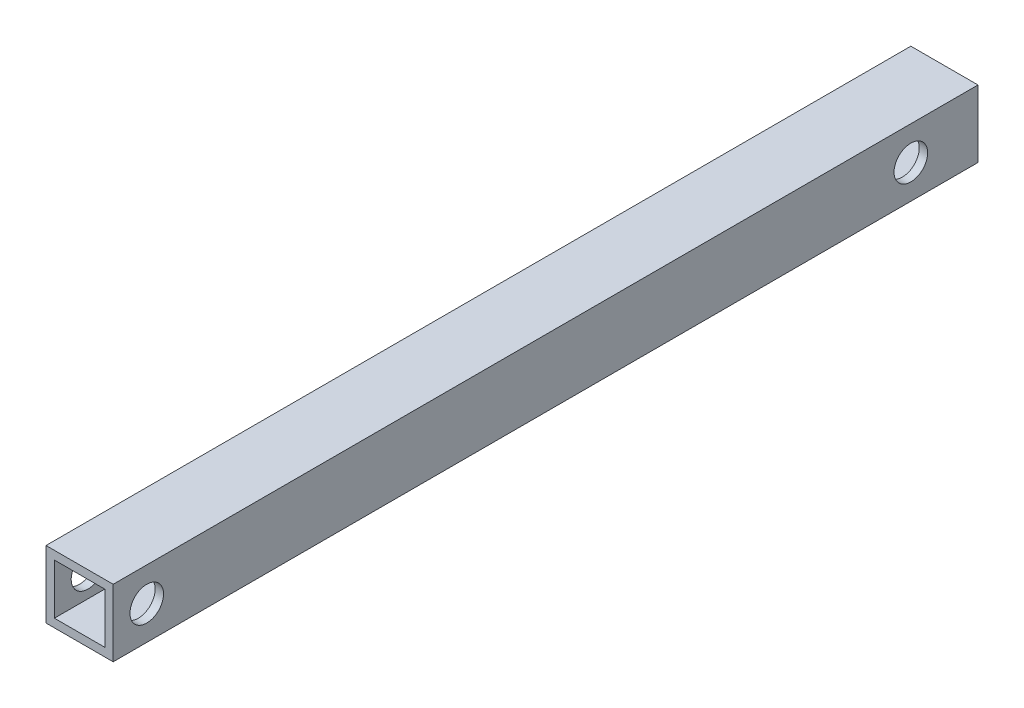
ISO-10303-21;
HEADER;
FILE_DESCRIPTION(('STEP AP214'),'2;1');
FILE_NAME('part.step','',(''),(''),'','','');
FILE_SCHEMA(('AUTOMOTIVE_DESIGN { 1 0 10303 214 1 1 1 1 }'));
ENDSEC;
DATA;
#1=APPLICATION_CONTEXT('core data for automotive mechanical design processes');
#2=APPLICATION_PROTOCOL_DEFINITION('international standard','automotive_design',2000,#1);
#3=PRODUCT_CONTEXT('',#1,'mechanical');
#4=PRODUCT('Part','Part','',(#3));
#5=PRODUCT_RELATED_PRODUCT_CATEGORY('part','',(#4));
#6=PRODUCT_DEFINITION_FORMATION('','',#4);
#7=PRODUCT_DEFINITION_CONTEXT('part definition',#1,'design');
#8=PRODUCT_DEFINITION('design','',#6,#7);
#9=PRODUCT_DEFINITION_SHAPE('','',#8);
#10=(LENGTH_UNIT() NAMED_UNIT(*) SI_UNIT(.MILLI.,.METRE.));
#11=(NAMED_UNIT(*) PLANE_ANGLE_UNIT() SI_UNIT($,.RADIAN.));
#12=(NAMED_UNIT(*) SI_UNIT($,.STERADIAN.) SOLID_ANGLE_UNIT());
#13=UNCERTAINTY_MEASURE_WITH_UNIT(LENGTH_MEASURE(1.E-05),#10,'distance_accuracy_value','');
#14=(GEOMETRIC_REPRESENTATION_CONTEXT(3) GLOBAL_UNCERTAINTY_ASSIGNED_CONTEXT((#13)) GLOBAL_UNIT_ASSIGNED_CONTEXT((#10,
#11,#12)) REPRESENTATION_CONTEXT('',''));
#15=CARTESIAN_POINT('',(0.,0.,0.));
#16=DIRECTION('',(0.,0.,1.));
#17=DIRECTION('',(1.,0.,0.));
#18=AXIS2_PLACEMENT_3D('',#15,#16,#17);
#19=CARTESIAN_POINT('',(0.,0.,327.025));
#20=DIRECTION('',(0.,0.,1.));
#21=DIRECTION('',(1.,0.,0.));
#22=AXIS2_PLACEMENT_3D('',#19,#20,#21);
#23=PLANE('',#22);
#24=DIRECTION('',(0.,1.,0.));
#25=VECTOR('',#24,1.);
#26=CARTESIAN_POINT('',(0.,0.,327.025));
#27=LINE('',#26,#25);
#28=CARTESIAN_POINT('',(0.,0.,327.025));
#29=VERTEX_POINT('',#28);
#30=CARTESIAN_POINT('',(0.,25.4,327.025));
#31=VERTEX_POINT('',#30);
#32=EDGE_CURVE('E157',#29,#31,#27,.T.);
#33=ORIENTED_EDGE('',*,*,#32,.T.);
#34=DIRECTION('',(-1.,0.,0.));
#35=VECTOR('',#34,1.);
#36=CARTESIAN_POINT('',(0.,25.4,327.025));
#37=LINE('',#36,#35);
#38=CARTESIAN_POINT('',(-25.4,25.4,327.025));
#39=VERTEX_POINT('',#38);
#40=EDGE_CURVE('E161',#31,#39,#37,.T.);
#41=ORIENTED_EDGE('',*,*,#40,.T.);
#42=DIRECTION('',(0.,-1.,0.));
#43=VECTOR('',#42,1.);
#44=CARTESIAN_POINT('',(-25.4,0.,327.025));
#45=LINE('',#44,#43);
#46=CARTESIAN_POINT('',(-25.4,0.,327.025));
#47=VERTEX_POINT('',#46);
#48=EDGE_CURVE('E165',#39,#47,#45,.T.);
#49=ORIENTED_EDGE('',*,*,#48,.T.);
#50=DIRECTION('',(1.,0.,0.));
#51=VECTOR('',#50,1.);
#52=CARTESIAN_POINT('',(0.,0.,327.025));
#53=LINE('',#52,#51);
#54=EDGE_CURVE('E168',#47,#29,#53,.T.);
#55=ORIENTED_EDGE('',*,*,#54,.T.);
#56=EDGE_LOOP('',(#33,#41,#49,#55));
#57=FACE_BOUND('',#56,.T.);
#58=DIRECTION('',(-1.,0.,0.));
#59=VECTOR('',#58,1.);
#60=CARTESIAN_POINT('',(-3.175,22.225,327.025));
#61=LINE('',#60,#59);
#62=CARTESIAN_POINT('',(-3.175,22.225,327.025));
#63=VERTEX_POINT('',#62);
#64=CARTESIAN_POINT('',(-22.225,22.225,327.025));
#65=VERTEX_POINT('',#64);
#66=EDGE_CURVE('E116',#63,#65,#61,.T.);
#67=ORIENTED_EDGE('',*,*,#66,.F.);
#68=DIRECTION('',(0.,1.,0.));
#69=VECTOR('',#68,1.);
#70=CARTESIAN_POINT('',(-3.175,22.225,327.025));
#71=LINE('',#70,#69);
#72=CARTESIAN_POINT('',(-3.175,3.175,327.025));
#73=VERTEX_POINT('',#72);
#74=EDGE_CURVE('E107',#73,#63,#71,.T.);
#75=ORIENTED_EDGE('',*,*,#74,.F.);
#76=DIRECTION('',(1.,0.,0.));
#77=VECTOR('',#76,1.);
#78=CARTESIAN_POINT('',(-3.175,3.175,327.025));
#79=LINE('',#78,#77);
#80=CARTESIAN_POINT('',(-22.225,3.175,327.025));
#81=VERTEX_POINT('',#80);
#82=EDGE_CURVE('E133',#81,#73,#79,.T.);
#83=ORIENTED_EDGE('',*,*,#82,.F.);
#84=DIRECTION('',(0.,-1.,0.));
#85=VECTOR('',#84,1.);
#86=CARTESIAN_POINT('',(-22.225,22.225,327.025));
#87=LINE('',#86,#85);
#88=EDGE_CURVE('E129',#65,#81,#87,.T.);
#89=ORIENTED_EDGE('',*,*,#88,.F.);
#90=EDGE_LOOP('',(#67,#75,#83,#89));
#91=FACE_BOUND('',#90,.T.);
#92=ADVANCED_FACE('F39',(#57,#91),#23,.T.);
#93=CARTESIAN_POINT('',(0.,0.,0.));
#94=DIRECTION('',(0.,0.,1.));
#95=DIRECTION('',(1.,0.,0.));
#96=AXIS2_PLACEMENT_3D('',#93,#94,#95);
#97=PLANE('',#96);
#98=DIRECTION('',(0.,1.,0.));
#99=VECTOR('',#98,1.);
#100=CARTESIAN_POINT('',(0.,0.,0.));
#101=LINE('',#100,#99);
#102=CARTESIAN_POINT('',(0.,0.,0.));
#103=VERTEX_POINT('',#102);
#104=CARTESIAN_POINT('',(0.,25.4,0.));
#105=VERTEX_POINT('',#104);
#106=EDGE_CURVE('E125',#103,#105,#101,.T.);
#107=ORIENTED_EDGE('',*,*,#106,.F.);
#108=DIRECTION('',(1.,0.,0.));
#109=VECTOR('',#108,1.);
#110=CARTESIAN_POINT('',(0.,0.,0.));
#111=LINE('',#110,#109);
#112=CARTESIAN_POINT('',(-25.4,0.,0.));
#113=VERTEX_POINT('',#112);
#114=EDGE_CURVE('E162',#113,#103,#111,.T.);
#115=ORIENTED_EDGE('',*,*,#114,.F.);
#116=DIRECTION('',(0.,-1.,0.));
#117=VECTOR('',#116,1.);
#118=CARTESIAN_POINT('',(-25.4,0.,0.));
#119=LINE('',#118,#117);
#120=CARTESIAN_POINT('',(-25.4,25.4,0.));
#121=VERTEX_POINT('',#120);
#122=EDGE_CURVE('E178',#121,#113,#119,.T.);
#123=ORIENTED_EDGE('',*,*,#122,.F.);
#124=DIRECTION('',(-1.,0.,0.));
#125=VECTOR('',#124,1.);
#126=CARTESIAN_POINT('',(0.,25.4,0.));
#127=LINE('',#126,#125);
#128=EDGE_CURVE('E175',#105,#121,#127,.T.);
#129=ORIENTED_EDGE('',*,*,#128,.F.);
#130=EDGE_LOOP('',(#107,#115,#123,#129));
#131=FACE_BOUND('',#130,.T.);
#132=DIRECTION('',(0.,1.,0.));
#133=VECTOR('',#132,1.);
#134=CARTESIAN_POINT('',(-3.175,22.225,0.));
#135=LINE('',#134,#133);
#136=CARTESIAN_POINT('',(-3.175,3.175,0.));
#137=VERTEX_POINT('',#136);
#138=CARTESIAN_POINT('',(-3.175,22.225,0.));
#139=VERTEX_POINT('',#138);
#140=EDGE_CURVE('E65',#137,#139,#135,.T.);
#141=ORIENTED_EDGE('',*,*,#140,.T.);
#142=DIRECTION('',(-1.,0.,0.));
#143=VECTOR('',#142,1.);
#144=CARTESIAN_POINT('',(-3.175,22.225,0.));
#145=LINE('',#144,#143);
#146=CARTESIAN_POINT('',(-22.225,22.225,0.));
#147=VERTEX_POINT('',#146);
#148=EDGE_CURVE('E123',#139,#147,#145,.T.);
#149=ORIENTED_EDGE('',*,*,#148,.T.);
#150=DIRECTION('',(0.,-1.,0.));
#151=VECTOR('',#150,1.);
#152=CARTESIAN_POINT('',(-22.225,22.225,0.));
#153=LINE('',#152,#151);
#154=CARTESIAN_POINT('',(-22.225,3.175,0.));
#155=VERTEX_POINT('',#154);
#156=EDGE_CURVE('E144',#147,#155,#153,.T.);
#157=ORIENTED_EDGE('',*,*,#156,.T.);
#158=DIRECTION('',(1.,0.,0.));
#159=VECTOR('',#158,1.);
#160=CARTESIAN_POINT('',(-3.175,3.175,0.));
#161=LINE('',#160,#159);
#162=EDGE_CURVE('E117',#155,#137,#161,.T.);
#163=ORIENTED_EDGE('',*,*,#162,.T.);
#164=EDGE_LOOP('',(#141,#149,#157,#163));
#165=FACE_BOUND('',#164,.T.);
#166=ADVANCED_FACE('F238',(#131,#165),#97,.F.);
#167=CARTESIAN_POINT('',(0.,0.,327.025));
#168=DIRECTION('',(-1.,0.,0.));
#169=DIRECTION('',(0.,-1.,0.));
#170=AXIS2_PLACEMENT_3D('',#167,#168,#169);
#171=PLANE('',#170);
#172=CARTESIAN_POINT('',(0.,12.7,25.4));
#173=DIRECTION('',(1.,0.,0.));
#174=DIRECTION('',(0.,1.,0.));
#175=AXIS2_PLACEMENT_3D('',#172,#173,#174);
#176=CIRCLE('',#175,6.35);
#177=CARTESIAN_POINT('',(0.,19.05,25.4));
#178=VERTEX_POINT('',#177);
#179=EDGE_CURVE('E204',#178,#178,#176,.T.);
#180=ORIENTED_EDGE('',*,*,#179,.F.);
#181=EDGE_LOOP('',(#180));
#182=FACE_BOUND('',#181,.T.);
#183=CARTESIAN_POINT('',(0.,12.7,314.325));
#184=DIRECTION('',(1.,0.,0.));
#185=DIRECTION('',(0.,1.,0.));
#186=AXIS2_PLACEMENT_3D('',#183,#184,#185);
#187=CIRCLE('',#186,6.35);
#188=CARTESIAN_POINT('',(0.,19.05,314.325));
#189=VERTEX_POINT('',#188);
#190=EDGE_CURVE('E216',#189,#189,#187,.T.);
#191=ORIENTED_EDGE('',*,*,#190,.F.);
#192=EDGE_LOOP('',(#191));
#193=FACE_BOUND('',#192,.T.);
#194=ORIENTED_EDGE('',*,*,#106,.T.);
#195=DIRECTION('',(0.,0.,-1.));
#196=VECTOR('',#195,1.);
#197=CARTESIAN_POINT('',(0.,25.4,327.025));
#198=LINE('',#197,#196);
#199=EDGE_CURVE('E11',#31,#105,#198,.T.);
#200=ORIENTED_EDGE('',*,*,#199,.F.);
#201=ORIENTED_EDGE('',*,*,#32,.F.);
#202=DIRECTION('',(0.,0.,-1.));
#203=VECTOR('',#202,1.);
#204=CARTESIAN_POINT('',(0.,0.,327.025));
#205=LINE('',#204,#203);
#206=EDGE_CURVE('E171',#29,#103,#205,.T.);
#207=ORIENTED_EDGE('',*,*,#206,.T.);
#208=EDGE_LOOP('',(#194,#200,#201,#207));
#209=FACE_BOUND('',#208,.T.);
#210=ADVANCED_FACE('F41',(#182,#193,#209),#171,.F.);
#211=CARTESIAN_POINT('',(0.,25.4,327.025));
#212=DIRECTION('',(0.,-1.,0.));
#213=DIRECTION('',(0.,0.,-1.));
#214=AXIS2_PLACEMENT_3D('',#211,#212,#213);
#215=PLANE('',#214);
#216=ORIENTED_EDGE('',*,*,#128,.T.);
#217=DIRECTION('',(0.,0.,-1.));
#218=VECTOR('',#217,1.);
#219=CARTESIAN_POINT('',(-25.4,25.4,327.025));
#220=LINE('',#219,#218);
#221=EDGE_CURVE('E49',#39,#121,#220,.T.);
#222=ORIENTED_EDGE('',*,*,#221,.F.);
#223=ORIENTED_EDGE('',*,*,#40,.F.);
#224=ORIENTED_EDGE('',*,*,#199,.T.);
#225=EDGE_LOOP('',(#216,#222,#223,#224));
#226=FACE_BOUND('',#225,.T.);
#227=ADVANCED_FACE('F264',(#226),#215,.F.);
#228=CARTESIAN_POINT('',(-25.4,0.,327.025));
#229=DIRECTION('',(1.,0.,0.));
#230=DIRECTION('',(0.,0.,-1.));
#231=AXIS2_PLACEMENT_3D('',#228,#229,#230);
#232=PLANE('',#231);
#233=CARTESIAN_POINT('',(-25.4,12.7,25.4));
#234=DIRECTION('',(1.,0.,0.));
#235=DIRECTION('',(0.,1.,0.));
#236=AXIS2_PLACEMENT_3D('',#233,#234,#235);
#237=CIRCLE('',#236,6.35);
#238=CARTESIAN_POINT('',(-25.4,19.05,25.4));
#239=VERTEX_POINT('',#238);
#240=EDGE_CURVE('E196',#239,#239,#237,.T.);
#241=ORIENTED_EDGE('',*,*,#240,.T.);
#242=EDGE_LOOP('',(#241));
#243=FACE_BOUND('',#242,.T.);
#244=CARTESIAN_POINT('',(-25.4,12.7,314.325));
#245=DIRECTION('',(1.,0.,0.));
#246=DIRECTION('',(0.,1.,0.));
#247=AXIS2_PLACEMENT_3D('',#244,#245,#246);
#248=CIRCLE('',#247,6.35);
#249=CARTESIAN_POINT('',(-25.4,19.05,314.325));
#250=VERTEX_POINT('',#249);
#251=EDGE_CURVE('E210',#250,#250,#248,.T.);
#252=ORIENTED_EDGE('',*,*,#251,.T.);
#253=EDGE_LOOP('',(#252));
#254=FACE_BOUND('',#253,.T.);
#255=ORIENTED_EDGE('',*,*,#122,.T.);
#256=DIRECTION('',(0.,0.,-1.));
#257=VECTOR('',#256,1.);
#258=CARTESIAN_POINT('',(-25.4,0.,327.025));
#259=LINE('',#258,#257);
#260=EDGE_CURVE('E186',#47,#113,#259,.T.);
#261=ORIENTED_EDGE('',*,*,#260,.F.);
#262=ORIENTED_EDGE('',*,*,#48,.F.);
#263=ORIENTED_EDGE('',*,*,#221,.T.);
#264=EDGE_LOOP('',(#255,#261,#262,#263));
#265=FACE_BOUND('',#264,.T.);
#266=ADVANCED_FACE('F261',(#243,#254,#265),#232,.F.);
#267=CARTESIAN_POINT('',(0.,0.,327.025));
#268=DIRECTION('',(0.,1.,0.));
#269=DIRECTION('',(-1.,0.,0.));
#270=AXIS2_PLACEMENT_3D('',#267,#268,#269);
#271=PLANE('',#270);
#272=ORIENTED_EDGE('',*,*,#114,.T.);
#273=ORIENTED_EDGE('',*,*,#206,.F.);
#274=ORIENTED_EDGE('',*,*,#54,.F.);
#275=ORIENTED_EDGE('',*,*,#260,.T.);
#276=EDGE_LOOP('',(#272,#273,#274,#275));
#277=FACE_BOUND('',#276,.T.);
#278=ADVANCED_FACE('F258',(#277),#271,.F.);
#279=CARTESIAN_POINT('',(-3.175,22.225,327.025));
#280=DIRECTION('',(-1.,0.,0.));
#281=DIRECTION('',(0.,-1.,0.));
#282=AXIS2_PLACEMENT_3D('',#279,#280,#281);
#283=PLANE('',#282);
#284=CARTESIAN_POINT('',(-3.175,12.7,25.4));
#285=DIRECTION('',(-1.,0.,0.));
#286=DIRECTION('',(0.,-1.,0.));
#287=AXIS2_PLACEMENT_3D('',#284,#285,#286);
#288=CIRCLE('',#287,6.35);
#289=CARTESIAN_POINT('',(-3.175,6.34999999999999,25.4));
#290=VERTEX_POINT('',#289);
#291=EDGE_CURVE('E141',#290,#290,#288,.T.);
#292=ORIENTED_EDGE('',*,*,#291,.F.);
#293=EDGE_LOOP('',(#292));
#294=FACE_BOUND('',#293,.T.);
#295=CARTESIAN_POINT('',(-3.175,12.7,314.325));
#296=DIRECTION('',(-1.,0.,0.));
#297=DIRECTION('',(0.,-1.,0.));
#298=AXIS2_PLACEMENT_3D('',#295,#296,#297);
#299=CIRCLE('',#298,6.35);
#300=CARTESIAN_POINT('',(-3.175,6.35,314.325));
#301=VERTEX_POINT('',#300);
#302=EDGE_CURVE('E195',#301,#301,#299,.T.);
#303=ORIENTED_EDGE('',*,*,#302,.F.);
#304=EDGE_LOOP('',(#303));
#305=FACE_BOUND('',#304,.T.);
#306=ORIENTED_EDGE('',*,*,#140,.F.);
#307=DIRECTION('',(0.,0.,-1.));
#308=VECTOR('',#307,1.);
#309=CARTESIAN_POINT('',(-3.175,3.175,327.025));
#310=LINE('',#309,#308);
#311=EDGE_CURVE('E111',#73,#137,#310,.T.);
#312=ORIENTED_EDGE('',*,*,#311,.F.);
#313=ORIENTED_EDGE('',*,*,#74,.T.);
#314=DIRECTION('',(0.,0.,-1.));
#315=VECTOR('',#314,1.);
#316=CARTESIAN_POINT('',(-3.175,22.225,327.025));
#317=LINE('',#316,#315);
#318=EDGE_CURVE('E110',#63,#139,#317,.T.);
#319=ORIENTED_EDGE('',*,*,#318,.T.);
#320=EDGE_LOOP('',(#306,#312,#313,#319));
#321=FACE_BOUND('',#320,.T.);
#322=ADVANCED_FACE('F109',(#294,#305,#321),#283,.T.);
#323=CARTESIAN_POINT('',(-3.175,22.225,327.025));
#324=DIRECTION('',(0.,-1.,0.));
#325=DIRECTION('',(1.,0.,0.));
#326=AXIS2_PLACEMENT_3D('',#323,#324,#325);
#327=PLANE('',#326);
#328=ORIENTED_EDGE('',*,*,#148,.F.);
#329=ORIENTED_EDGE('',*,*,#318,.F.);
#330=ORIENTED_EDGE('',*,*,#66,.T.);
#331=DIRECTION('',(0.,0.,-1.));
#332=VECTOR('',#331,1.);
#333=CARTESIAN_POINT('',(-22.225,22.225,327.025));
#334=LINE('',#333,#332);
#335=EDGE_CURVE('E126',#65,#147,#334,.T.);
#336=ORIENTED_EDGE('',*,*,#335,.T.);
#337=EDGE_LOOP('',(#328,#329,#330,#336));
#338=FACE_BOUND('',#337,.T.);
#339=ADVANCED_FACE('F120',(#338),#327,.T.);
#340=CARTESIAN_POINT('',(-22.225,22.225,327.025));
#341=DIRECTION('',(1.,0.,0.));
#342=DIRECTION('',(0.,0.,-1.));
#343=AXIS2_PLACEMENT_3D('',#340,#341,#342);
#344=PLANE('',#343);
#345=CARTESIAN_POINT('',(-22.225,12.7,25.4));
#346=DIRECTION('',(1.,0.,0.));
#347=DIRECTION('',(0.,0.,-1.));
#348=AXIS2_PLACEMENT_3D('',#345,#346,#347);
#349=CIRCLE('',#348,6.35);
#350=CARTESIAN_POINT('',(-22.225,12.7,19.05));
#351=VERTEX_POINT('',#350);
#352=EDGE_CURVE('E43',#351,#351,#349,.T.);
#353=ORIENTED_EDGE('',*,*,#352,.F.);
#354=EDGE_LOOP('',(#353));
#355=FACE_BOUND('',#354,.T.);
#356=CARTESIAN_POINT('',(-22.225,12.7,314.325));
#357=DIRECTION('',(1.,0.,0.));
#358=DIRECTION('',(0.,0.,-1.));
#359=AXIS2_PLACEMENT_3D('',#356,#357,#358);
#360=CIRCLE('',#359,6.35);
#361=CARTESIAN_POINT('',(-22.225,12.7,307.975));
#362=VERTEX_POINT('',#361);
#363=EDGE_CURVE('E192',#362,#362,#360,.T.);
#364=ORIENTED_EDGE('',*,*,#363,.F.);
#365=EDGE_LOOP('',(#364));
#366=FACE_BOUND('',#365,.T.);
#367=ORIENTED_EDGE('',*,*,#156,.F.);
#368=ORIENTED_EDGE('',*,*,#335,.F.);
#369=ORIENTED_EDGE('',*,*,#88,.T.);
#370=DIRECTION('',(0.,0.,-1.));
#371=VECTOR('',#370,1.);
#372=CARTESIAN_POINT('',(-22.225,3.175,327.025));
#373=LINE('',#372,#371);
#374=EDGE_CURVE('E57',#81,#155,#373,.T.);
#375=ORIENTED_EDGE('',*,*,#374,.T.);
#376=EDGE_LOOP('',(#367,#368,#369,#375));
#377=FACE_BOUND('',#376,.T.);
#378=ADVANCED_FACE('F230',(#355,#366,#377),#344,.T.);
#379=CARTESIAN_POINT('',(-3.175,3.175,327.025));
#380=DIRECTION('',(0.,1.,0.));
#381=DIRECTION('',(-1.,0.,0.));
#382=AXIS2_PLACEMENT_3D('',#379,#380,#381);
#383=PLANE('',#382);
#384=ORIENTED_EDGE('',*,*,#162,.F.);
#385=ORIENTED_EDGE('',*,*,#374,.F.);
#386=ORIENTED_EDGE('',*,*,#82,.T.);
#387=ORIENTED_EDGE('',*,*,#311,.T.);
#388=EDGE_LOOP('',(#384,#385,#386,#387));
#389=FACE_BOUND('',#388,.T.);
#390=ADVANCED_FACE('F233',(#389),#383,.T.);
#391=CARTESIAN_POINT('',(-25.4,12.7,314.325));
#392=DIRECTION('',(1.,0.,0.));
#393=DIRECTION('',(0.,1.,0.));
#394=AXIS2_PLACEMENT_3D('',#391,#392,#393);
#395=CYLINDRICAL_SURFACE('',#394,6.35);
#396=ORIENTED_EDGE('',*,*,#363,.T.);
#397=EDGE_LOOP('',(#396));
#398=FACE_BOUND('',#397,.T.);
#399=ORIENTED_EDGE('',*,*,#251,.F.);
#400=EDGE_LOOP('',(#399));
#401=FACE_BOUND('',#400,.T.);
#402=ADVANCED_FACE('F240',(#398,#401),#395,.F.);
#403=CARTESIAN_POINT('',(-25.4,12.7,25.4));
#404=DIRECTION('',(1.,0.,0.));
#405=DIRECTION('',(0.,1.,0.));
#406=AXIS2_PLACEMENT_3D('',#403,#404,#405);
#407=CYLINDRICAL_SURFACE('',#406,6.35);
#408=ORIENTED_EDGE('',*,*,#352,.T.);
#409=EDGE_LOOP('',(#408));
#410=FACE_BOUND('',#409,.T.);
#411=ORIENTED_EDGE('',*,*,#240,.F.);
#412=EDGE_LOOP('',(#411));
#413=FACE_BOUND('',#412,.T.);
#414=ADVANCED_FACE('F227',(#410,#413),#407,.F.);
#415=ORIENTED_EDGE('',*,*,#302,.T.);
#416=EDGE_LOOP('',(#415));
#417=FACE_BOUND('',#416,.T.);
#418=ORIENTED_EDGE('',*,*,#190,.T.);
#419=EDGE_LOOP('',(#418));
#420=FACE_BOUND('',#419,.T.);
#421=ADVANCED_FACE('F246',(#417,#420),#395,.F.);
#422=ORIENTED_EDGE('',*,*,#291,.T.);
#423=EDGE_LOOP('',(#422));
#424=FACE_BOUND('',#423,.T.);
#425=ORIENTED_EDGE('',*,*,#179,.T.);
#426=EDGE_LOOP('',(#425));
#427=FACE_BOUND('',#426,.T.);
#428=ADVANCED_FACE('F290',(#424,#427),#407,.F.);
#429=CLOSED_SHELL('',(#92,#166,#210,#227,#266,#278,#322,#339,#378,#390,#402,#414,#421,#428));
#430=MANIFOLD_SOLID_BREP('B2',#429);
#431=ADVANCED_BREP_SHAPE_REPRESENTATION('',(#18,#430),#14);
#432=SHAPE_DEFINITION_REPRESENTATION(#9,#431);
ENDSEC;
END-ISO-10303-21;
